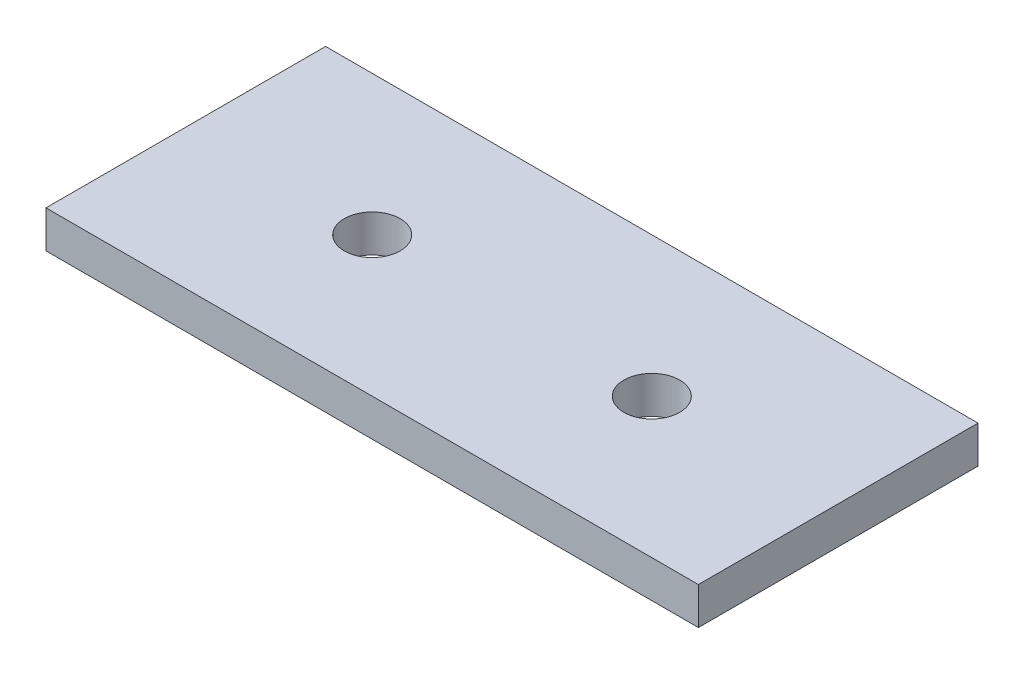
ISO-10303-21;
HEADER;
FILE_DESCRIPTION(('STEP AP214'),'2;1');
FILE_NAME('part.step','',(''),(''),'','','');
FILE_SCHEMA(('AUTOMOTIVE_DESIGN { 1 0 10303 214 1 1 1 1 }'));
ENDSEC;
DATA;
#1=APPLICATION_CONTEXT('core data for automotive mechanical design processes');
#2=APPLICATION_PROTOCOL_DEFINITION('international standard','automotive_design',2000,#1);
#3=PRODUCT_CONTEXT('',#1,'mechanical');
#4=PRODUCT('Part','Part','',(#3));
#5=PRODUCT_RELATED_PRODUCT_CATEGORY('part','',(#4));
#6=PRODUCT_DEFINITION_FORMATION('','',#4);
#7=PRODUCT_DEFINITION_CONTEXT('part definition',#1,'design');
#8=PRODUCT_DEFINITION('design','',#6,#7);
#9=PRODUCT_DEFINITION_SHAPE('','',#8);
#10=(LENGTH_UNIT() NAMED_UNIT(*) SI_UNIT(.MILLI.,.METRE.));
#11=(NAMED_UNIT(*) PLANE_ANGLE_UNIT() SI_UNIT($,.RADIAN.));
#12=(NAMED_UNIT(*) SI_UNIT($,.STERADIAN.) SOLID_ANGLE_UNIT());
#13=UNCERTAINTY_MEASURE_WITH_UNIT(LENGTH_MEASURE(1.E-05),#10,'distance_accuracy_value','');
#14=(GEOMETRIC_REPRESENTATION_CONTEXT(3) GLOBAL_UNCERTAINTY_ASSIGNED_CONTEXT((#13)) GLOBAL_UNIT_ASSIGNED_CONTEXT((#10,
#11,#12)) REPRESENTATION_CONTEXT('',''));
#15=CARTESIAN_POINT('',(0.,0.,0.));
#16=DIRECTION('',(0.,0.,1.));
#17=DIRECTION('',(1.,0.,0.));
#18=AXIS2_PLACEMENT_3D('',#15,#16,#17);
#19=CARTESIAN_POINT('',(0.,2.,-15.));
#20=DIRECTION('',(0.,0.,-1.));
#21=DIRECTION('',(-1.,0.,0.));
#22=AXIS2_PLACEMENT_3D('',#19,#20,#21);
#23=PLANE('',#22);
#24=DIRECTION('',(1.,0.,0.));
#25=VECTOR('',#24,1.);
#26=CARTESIAN_POINT('',(0.,0.,-15.));
#27=LINE('',#26,#25);
#28=CARTESIAN_POINT('',(0.,0.,-15.));
#29=VERTEX_POINT('',#28);
#30=CARTESIAN_POINT('',(35.,0.,-15.));
#31=VERTEX_POINT('',#30);
#32=EDGE_CURVE('E109',#29,#31,#27,.T.);
#33=ORIENTED_EDGE('',*,*,#32,.F.);
#34=DIRECTION('',(0.,-1.,0.));
#35=VECTOR('',#34,1.);
#36=CARTESIAN_POINT('',(0.,2.,-15.));
#37=LINE('',#36,#35);
#38=CARTESIAN_POINT('',(0.,2.,-15.));
#39=VERTEX_POINT('',#38);
#40=EDGE_CURVE('E11',#39,#29,#37,.T.);
#41=ORIENTED_EDGE('',*,*,#40,.F.);
#42=DIRECTION('',(1.,0.,0.));
#43=VECTOR('',#42,1.);
#44=CARTESIAN_POINT('',(0.,2.,-15.));
#45=LINE('',#44,#43);
#46=CARTESIAN_POINT('',(35.,2.,-15.));
#47=VERTEX_POINT('',#46);
#48=EDGE_CURVE('E96',#39,#47,#45,.T.);
#49=ORIENTED_EDGE('',*,*,#48,.T.);
#50=DIRECTION('',(0.,-1.,0.));
#51=VECTOR('',#50,1.);
#52=CARTESIAN_POINT('',(35.,2.,-15.));
#53=LINE('',#52,#51);
#54=EDGE_CURVE('E75',#47,#31,#53,.T.);
#55=ORIENTED_EDGE('',*,*,#54,.T.);
#56=EDGE_LOOP('',(#33,#41,#49,#55));
#57=FACE_BOUND('',#56,.T.);
#58=ADVANCED_FACE('F35',(#57),#23,.T.);
#59=CARTESIAN_POINT('',(0.,2.,0.));
#60=DIRECTION('',(-1.,0.,0.));
#61=DIRECTION('',(0.,0.,1.));
#62=AXIS2_PLACEMENT_3D('',#59,#60,#61);
#63=PLANE('',#62);
#64=DIRECTION('',(0.,0.,-1.));
#65=VECTOR('',#64,1.);
#66=CARTESIAN_POINT('',(0.,0.,0.));
#67=LINE('',#66,#65);
#68=CARTESIAN_POINT('',(0.,0.,0.));
#69=VERTEX_POINT('',#68);
#70=EDGE_CURVE('E87',#69,#29,#67,.T.);
#71=ORIENTED_EDGE('',*,*,#70,.F.);
#72=DIRECTION('',(0.,-1.,0.));
#73=VECTOR('',#72,1.);
#74=CARTESIAN_POINT('',(0.,2.,0.));
#75=LINE('',#74,#73);
#76=CARTESIAN_POINT('',(0.,2.,0.));
#77=VERTEX_POINT('',#76);
#78=EDGE_CURVE('E44',#77,#69,#75,.T.);
#79=ORIENTED_EDGE('',*,*,#78,.F.);
#80=DIRECTION('',(0.,0.,-1.));
#81=VECTOR('',#80,1.);
#82=CARTESIAN_POINT('',(0.,2.,0.));
#83=LINE('',#82,#81);
#84=EDGE_CURVE('E85',#77,#39,#83,.T.);
#85=ORIENTED_EDGE('',*,*,#84,.T.);
#86=ORIENTED_EDGE('',*,*,#40,.T.);
#87=EDGE_LOOP('',(#71,#79,#85,#86));
#88=FACE_BOUND('',#87,.T.);
#89=ADVANCED_FACE('F83',(#88),#63,.T.);
#90=CARTESIAN_POINT('',(0.,2.,0.));
#91=DIRECTION('',(0.,0.,-1.));
#92=DIRECTION('',(-1.,0.,0.));
#93=AXIS2_PLACEMENT_3D('',#90,#91,#92);
#94=PLANE('',#93);
#95=DIRECTION('',(1.,0.,0.));
#96=VECTOR('',#95,1.);
#97=CARTESIAN_POINT('',(0.,0.,0.));
#98=LINE('',#97,#96);
#99=CARTESIAN_POINT('',(35.,0.,0.));
#100=VERTEX_POINT('',#99);
#101=EDGE_CURVE('E112',#69,#100,#98,.T.);
#102=ORIENTED_EDGE('',*,*,#101,.T.);
#103=DIRECTION('',(0.,-1.,0.));
#104=VECTOR('',#103,1.);
#105=CARTESIAN_POINT('',(35.,2.,0.));
#106=LINE('',#105,#104);
#107=CARTESIAN_POINT('',(35.,2.,0.));
#108=VERTEX_POINT('',#107);
#109=EDGE_CURVE('E90',#108,#100,#106,.T.);
#110=ORIENTED_EDGE('',*,*,#109,.F.);
#111=DIRECTION('',(1.,0.,0.));
#112=VECTOR('',#111,1.);
#113=CARTESIAN_POINT('',(0.,2.,0.));
#114=LINE('',#113,#112);
#115=EDGE_CURVE('E92',#77,#108,#114,.T.);
#116=ORIENTED_EDGE('',*,*,#115,.F.);
#117=ORIENTED_EDGE('',*,*,#78,.T.);
#118=EDGE_LOOP('',(#102,#110,#116,#117));
#119=FACE_BOUND('',#118,.T.);
#120=ADVANCED_FACE('F93',(#119),#94,.F.);
#121=CARTESIAN_POINT('',(10.,2.,-7.5));
#122=DIRECTION('',(0.,-1.,0.));
#123=DIRECTION('',(0.,0.,-1.));
#124=AXIS2_PLACEMENT_3D('',#121,#122,#123);
#125=CYLINDRICAL_SURFACE('',#124,1.5);
#126=CARTESIAN_POINT('',(10.,2.,-7.5));
#127=DIRECTION('',(0.,1.,0.));
#128=DIRECTION('',(0.,0.,1.));
#129=AXIS2_PLACEMENT_3D('',#126,#127,#128);
#130=CIRCLE('',#129,1.5);
#131=CARTESIAN_POINT('',(10.,2.,-6.));
#132=VERTEX_POINT('',#131);
#133=EDGE_CURVE('E98',#132,#132,#130,.T.);
#134=ORIENTED_EDGE('',*,*,#133,.T.);
#135=EDGE_LOOP('',(#134));
#136=FACE_BOUND('',#135,.T.);
#137=CARTESIAN_POINT('',(10.,0.,-7.5));
#138=DIRECTION('',(0.,1.,0.));
#139=DIRECTION('',(0.,0.,1.));
#140=AXIS2_PLACEMENT_3D('',#137,#138,#139);
#141=CIRCLE('',#140,1.5);
#142=CARTESIAN_POINT('',(10.,0.,-6.));
#143=VERTEX_POINT('',#142);
#144=EDGE_CURVE('E106',#143,#143,#141,.T.);
#145=ORIENTED_EDGE('',*,*,#144,.F.);
#146=EDGE_LOOP('',(#145));
#147=FACE_BOUND('',#146,.T.);
#148=ADVANCED_FACE('F127',(#136,#147),#125,.F.);
#149=CARTESIAN_POINT('',(25.,2.,-7.5));
#150=DIRECTION('',(0.,-1.,0.));
#151=DIRECTION('',(0.,0.,-1.));
#152=AXIS2_PLACEMENT_3D('',#149,#150,#151);
#153=CYLINDRICAL_SURFACE('',#152,1.5);
#154=CARTESIAN_POINT('',(25.,2.,-7.5));
#155=DIRECTION('',(0.,1.,0.));
#156=DIRECTION('',(0.,0.,1.));
#157=AXIS2_PLACEMENT_3D('',#154,#155,#156);
#158=CIRCLE('',#157,1.5);
#159=CARTESIAN_POINT('',(25.,2.,-6.));
#160=VERTEX_POINT('',#159);
#161=EDGE_CURVE('E115',#160,#160,#158,.T.);
#162=ORIENTED_EDGE('',*,*,#161,.T.);
#163=EDGE_LOOP('',(#162));
#164=FACE_BOUND('',#163,.T.);
#165=CARTESIAN_POINT('',(25.,0.,-7.5));
#166=DIRECTION('',(0.,1.,0.));
#167=DIRECTION('',(0.,0.,1.));
#168=AXIS2_PLACEMENT_3D('',#165,#166,#167);
#169=CIRCLE('',#168,1.5);
#170=CARTESIAN_POINT('',(25.,0.,-6.));
#171=VERTEX_POINT('',#170);
#172=EDGE_CURVE('E103',#171,#171,#169,.T.);
#173=ORIENTED_EDGE('',*,*,#172,.F.);
#174=EDGE_LOOP('',(#173));
#175=FACE_BOUND('',#174,.T.);
#176=ADVANCED_FACE('F37',(#164,#175),#153,.F.);
#177=CARTESIAN_POINT('',(35.,2.,0.));
#178=DIRECTION('',(-1.,0.,0.));
#179=DIRECTION('',(0.,0.,1.));
#180=AXIS2_PLACEMENT_3D('',#177,#178,#179);
#181=PLANE('',#180);
#182=DIRECTION('',(0.,0.,-1.));
#183=VECTOR('',#182,1.);
#184=CARTESIAN_POINT('',(35.,0.,0.));
#185=LINE('',#184,#183);
#186=EDGE_CURVE('E68',#100,#31,#185,.T.);
#187=ORIENTED_EDGE('',*,*,#186,.T.);
#188=ORIENTED_EDGE('',*,*,#54,.F.);
#189=DIRECTION('',(0.,0.,-1.));
#190=VECTOR('',#189,1.);
#191=CARTESIAN_POINT('',(35.,2.,0.));
#192=LINE('',#191,#190);
#193=EDGE_CURVE('E52',#108,#47,#192,.T.);
#194=ORIENTED_EDGE('',*,*,#193,.F.);
#195=ORIENTED_EDGE('',*,*,#109,.T.);
#196=EDGE_LOOP('',(#187,#188,#194,#195));
#197=FACE_BOUND('',#196,.T.);
#198=ADVANCED_FACE('F118',(#197),#181,.F.);
#199=CARTESIAN_POINT('',(0.,2.,0.));
#200=DIRECTION('',(0.,1.,0.));
#201=DIRECTION('',(0.,0.,1.));
#202=AXIS2_PLACEMENT_3D('',#199,#200,#201);
#203=PLANE('',#202);
#204=ORIENTED_EDGE('',*,*,#161,.F.);
#205=EDGE_LOOP('',(#204));
#206=FACE_BOUND('',#205,.T.);
#207=ORIENTED_EDGE('',*,*,#133,.F.);
#208=EDGE_LOOP('',(#207));
#209=FACE_BOUND('',#208,.T.);
#210=ORIENTED_EDGE('',*,*,#48,.F.);
#211=ORIENTED_EDGE('',*,*,#84,.F.);
#212=ORIENTED_EDGE('',*,*,#115,.T.);
#213=ORIENTED_EDGE('',*,*,#193,.T.);
#214=EDGE_LOOP('',(#210,#211,#212,#213));
#215=FACE_BOUND('',#214,.T.);
#216=ADVANCED_FACE('F95',(#206,#209,#215),#203,.T.);
#217=CARTESIAN_POINT('',(0.,0.,0.));
#218=DIRECTION('',(0.,1.,0.));
#219=DIRECTION('',(0.,0.,1.));
#220=AXIS2_PLACEMENT_3D('',#217,#218,#219);
#221=PLANE('',#220);
#222=ORIENTED_EDGE('',*,*,#172,.T.);
#223=EDGE_LOOP('',(#222));
#224=FACE_BOUND('',#223,.T.);
#225=ORIENTED_EDGE('',*,*,#144,.T.);
#226=EDGE_LOOP('',(#225));
#227=FACE_BOUND('',#226,.T.);
#228=ORIENTED_EDGE('',*,*,#32,.T.);
#229=ORIENTED_EDGE('',*,*,#186,.F.);
#230=ORIENTED_EDGE('',*,*,#101,.F.);
#231=ORIENTED_EDGE('',*,*,#70,.T.);
#232=EDGE_LOOP('',(#228,#229,#230,#231));
#233=FACE_BOUND('',#232,.T.);
#234=ADVANCED_FACE('F119',(#224,#227,#233),#221,.F.);
#235=CLOSED_SHELL('',(#58,#89,#120,#148,#176,#198,#216,#234));
#236=MANIFOLD_SOLID_BREP('B2',#235);
#237=ADVANCED_BREP_SHAPE_REPRESENTATION('',(#18,#236),#14);
#238=SHAPE_DEFINITION_REPRESENTATION(#9,#237);
ENDSEC;
END-ISO-10303-21;
